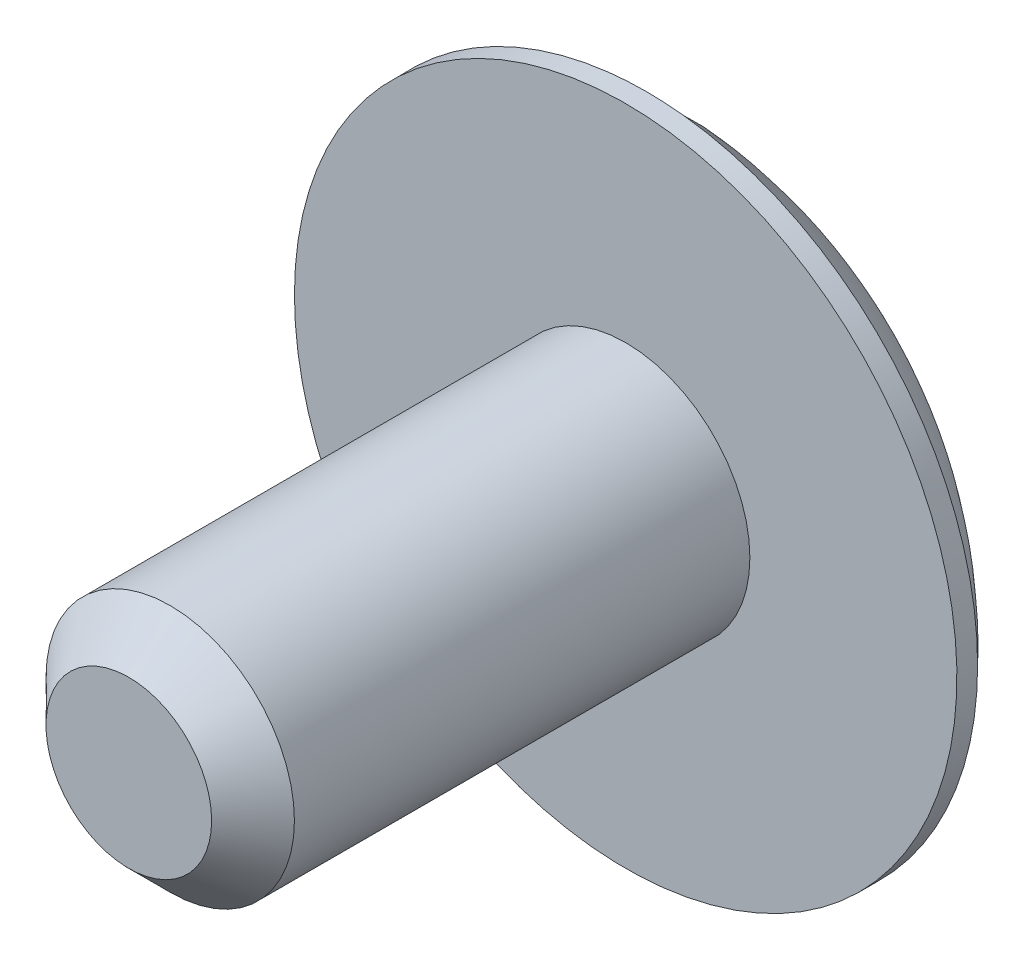
ISO-10303-21;
HEADER;
FILE_DESCRIPTION(('STEP AP214'),'2;1');
FILE_NAME('part.step','',(''),(''),'','','');
FILE_SCHEMA(('AUTOMOTIVE_DESIGN { 1 0 10303 214 1 1 1 1 }'));
ENDSEC;
DATA;
#1=APPLICATION_CONTEXT('core data for automotive mechanical design processes');
#2=APPLICATION_PROTOCOL_DEFINITION('international standard','automotive_design',2000,#1);
#3=PRODUCT_CONTEXT('',#1,'mechanical');
#4=PRODUCT('Part','Part','',(#3));
#5=PRODUCT_RELATED_PRODUCT_CATEGORY('part','',(#4));
#6=PRODUCT_DEFINITION_FORMATION('','',#4);
#7=PRODUCT_DEFINITION_CONTEXT('part definition',#1,'design');
#8=PRODUCT_DEFINITION('design','',#6,#7);
#9=PRODUCT_DEFINITION_SHAPE('','',#8);
#10=(LENGTH_UNIT() NAMED_UNIT(*) SI_UNIT(.MILLI.,.METRE.));
#11=(NAMED_UNIT(*) PLANE_ANGLE_UNIT() SI_UNIT($,.RADIAN.));
#12=(NAMED_UNIT(*) SI_UNIT($,.STERADIAN.) SOLID_ANGLE_UNIT());
#13=UNCERTAINTY_MEASURE_WITH_UNIT(LENGTH_MEASURE(1.E-05),#10,'distance_accuracy_value','');
#14=(GEOMETRIC_REPRESENTATION_CONTEXT(3) GLOBAL_UNCERTAINTY_ASSIGNED_CONTEXT((#13)) GLOBAL_UNIT_ASSIGNED_CONTEXT((#10,
#11,#12)) REPRESENTATION_CONTEXT('',''));
#15=CARTESIAN_POINT('',(0.,0.,0.));
#16=DIRECTION('',(0.,0.,1.));
#17=DIRECTION('',(1.,0.,0.));
#18=AXIS2_PLACEMENT_3D('',#15,#16,#17);
#19=CARTESIAN_POINT('',(0.,0.,6.89285714285714));
#20=DIRECTION('',(0.,0.,1.));
#21=DIRECTION('',(1.,0.,0.));
#22=AXIS2_PLACEMENT_3D('',#19,#20,#21);
#23=SPHERICAL_SURFACE('',#22,10.8928571428571);
#24=CARTESIAN_POINT('',(-0.9,0.,6.89285714285714));
#25=DIRECTION('',(-1.,0.,0.));
#26=DIRECTION('',(0.,0.,1.));
#27=AXIS2_PLACEMENT_3D('',#24,#25,#26);
#28=CIRCLE('',#27,10.8556131441155);
#29=CARTESIAN_POINT('',(-0.9,-7.94921379760288,-0.5));
#30=VERTEX_POINT('',#29);
#31=CARTESIAN_POINT('',(-0.9,-0.858628386596597,-3.92874597444597));
#32=VERTEX_POINT('',#31);
#33=EDGE_CURVE('E52',#30,#32,#28,.F.);
#34=ORIENTED_EDGE('',*,*,#33,.F.);
#35=CARTESIAN_POINT('',(0.,0.,-0.5));
#36=DIRECTION('',(0.,0.,-1.));
#37=DIRECTION('',(-1.,0.,0.));
#38=AXIS2_PLACEMENT_3D('',#35,#36,#37);
#39=CIRCLE('',#38,8.);
#40=CARTESIAN_POINT('',(-0.9,7.94921379760288,-0.5));
#41=VERTEX_POINT('',#40);
#42=EDGE_CURVE('E168',#30,#41,#39,.T.);
#43=ORIENTED_EDGE('',*,*,#42,.T.);
#44=CARTESIAN_POINT('',(-0.9,0.,6.89285714285714));
#45=DIRECTION('',(-1.,0.,0.));
#46=DIRECTION('',(0.,-1.,0.));
#47=AXIS2_PLACEMENT_3D('',#44,#45,#46);
#48=CIRCLE('',#47,10.8556131441155);
#49=CARTESIAN_POINT('',(-0.9,0.858628386596597,-3.92874597444597));
#50=VERTEX_POINT('',#49);
#51=EDGE_CURVE('E183',#50,#41,#48,.F.);
#52=ORIENTED_EDGE('',*,*,#51,.F.);
#53=CARTESIAN_POINT('',(0.,0.858628386596597,6.89285714285714));
#54=DIRECTION('',(0.,1.,0.));
#55=DIRECTION('',(-1.,0.,0.));
#56=AXIS2_PLACEMENT_3D('',#53,#54,#55);
#57=CIRCLE('',#56,10.8589637640258);
#58=CARTESIAN_POINT('',(-3.,0.858628386596596,-3.54347813483609));
#59=VERTEX_POINT('',#58);
#60=EDGE_CURVE('E185',#59,#50,#57,.F.);
#61=ORIENTED_EDGE('',*,*,#60,.F.);
#62=CARTESIAN_POINT('',(-3.,0.,6.89285714285714));
#63=DIRECTION('',(-1.,0.,0.));
#64=DIRECTION('',(0.,0.,1.));
#65=AXIS2_PLACEMENT_3D('',#62,#63,#64);
#66=CIRCLE('',#65,10.4715966659671);
#67=CARTESIAN_POINT('',(-3.,-0.858628386596598,-3.5434781348361));
#68=VERTEX_POINT('',#67);
#69=EDGE_CURVE('E187',#68,#59,#66,.F.);
#70=ORIENTED_EDGE('',*,*,#69,.F.);
#71=CARTESIAN_POINT('',(0.,-0.858628386596597,6.89285714285714));
#72=DIRECTION('',(0.,-1.,0.));
#73=DIRECTION('',(1.,0.,0.));
#74=AXIS2_PLACEMENT_3D('',#71,#72,#73);
#75=CIRCLE('',#74,10.8589637640258);
#76=EDGE_CURVE('E189',#32,#68,#75,.F.);
#77=ORIENTED_EDGE('',*,*,#76,.F.);
#78=EDGE_LOOP('',(#34,#43,#52,#61,#70,#77));
#79=FACE_BOUND('',#78,.T.);
#80=ADVANCED_FACE('F29',(#79),#23,.T.);
#81=CARTESIAN_POINT('',(0.,0.,12.));
#82=DIRECTION('',(0.,0.,-1.));
#83=DIRECTION('',(-1.,0.,0.));
#84=AXIS2_PLACEMENT_3D('',#81,#82,#83);
#85=CYLINDRICAL_SURFACE('',#84,3.);
#86=CARTESIAN_POINT('',(0.,0.,11.));
#87=DIRECTION('',(0.,0.,1.));
#88=DIRECTION('',(1.,0.,0.));
#89=AXIS2_PLACEMENT_3D('',#86,#87,#88);
#90=CIRCLE('',#89,3.);
#91=CARTESIAN_POINT('',(3.,0.,11.));
#92=VERTEX_POINT('',#91);
#93=EDGE_CURVE('E11',#92,#92,#90,.F.);
#94=ORIENTED_EDGE('',*,*,#93,.T.);
#95=EDGE_LOOP('',(#94));
#96=FACE_BOUND('',#95,.T.);
#97=CARTESIAN_POINT('',(0.,0.,0.));
#98=DIRECTION('',(0.,0.,-1.));
#99=DIRECTION('',(-1.,0.,0.));
#100=AXIS2_PLACEMENT_3D('',#97,#98,#99);
#101=CIRCLE('',#100,3.);
#102=CARTESIAN_POINT('',(-3.,0.,0.));
#103=VERTEX_POINT('',#102);
#104=EDGE_CURVE('E171',#103,#103,#101,.T.);
#105=ORIENTED_EDGE('',*,*,#104,.F.);
#106=EDGE_LOOP('',(#105));
#107=FACE_BOUND('',#106,.T.);
#108=ADVANCED_FACE('F206',(#96,#107),#85,.T.);
#109=CARTESIAN_POINT('',(0.,0.,12.));
#110=DIRECTION('',(0.,0.,1.));
#111=DIRECTION('',(1.,0.,0.));
#112=AXIS2_PLACEMENT_3D('',#109,#110,#111);
#113=PLANE('',#112);
#114=CARTESIAN_POINT('',(0.,0.,12.));
#115=DIRECTION('',(0.,0.,1.));
#116=DIRECTION('',(1.,0.,0.));
#117=AXIS2_PLACEMENT_3D('',#114,#115,#116);
#118=CIRCLE('',#117,2.);
#119=CARTESIAN_POINT('',(2.,0.,12.));
#120=VERTEX_POINT('',#119);
#121=EDGE_CURVE('E37',#120,#120,#118,.T.);
#122=ORIENTED_EDGE('',*,*,#121,.T.);
#123=EDGE_LOOP('',(#122));
#124=FACE_BOUND('',#123,.T.);
#125=ADVANCED_FACE('F194',(#124),#113,.T.);
#126=CARTESIAN_POINT('',(0.,0.,0.));
#127=DIRECTION('',(0.,0.,-1.));
#128=DIRECTION('',(-1.,0.,0.));
#129=AXIS2_PLACEMENT_3D('',#126,#127,#128);
#130=PLANE('',#129);
#131=CARTESIAN_POINT('',(0.,0.,0.));
#132=DIRECTION('',(0.,0.,-1.));
#133=DIRECTION('',(-1.,0.,0.));
#134=AXIS2_PLACEMENT_3D('',#131,#132,#133);
#135=CIRCLE('',#134,8.);
#136=CARTESIAN_POINT('',(-8.,0.,0.));
#137=VERTEX_POINT('',#136);
#138=EDGE_CURVE('E154',#137,#137,#135,.T.);
#139=ORIENTED_EDGE('',*,*,#138,.F.);
#140=EDGE_LOOP('',(#139));
#141=FACE_BOUND('',#140,.T.);
#142=ORIENTED_EDGE('',*,*,#104,.T.);
#143=EDGE_LOOP('',(#142));
#144=FACE_BOUND('',#143,.T.);
#145=ADVANCED_FACE('F221',(#141,#144),#130,.F.);
#146=CARTESIAN_POINT('',(0.,0.,-0.5));
#147=DIRECTION('',(0.,0.,1.));
#148=DIRECTION('',(1.,0.,0.));
#149=AXIS2_PLACEMENT_3D('',#146,#147,#148);
#150=CYLINDRICAL_SURFACE('',#149,8.);
#151=CARTESIAN_POINT('',(0.9,7.94921379760288,-0.5));
#152=VERTEX_POINT('',#151);
#153=EDGE_CURVE('E169',#41,#152,#39,.T.);
#154=ORIENTED_EDGE('',*,*,#153,.F.);
#155=ORIENTED_EDGE('',*,*,#42,.F.);
#156=CARTESIAN_POINT('',(0.900000000000004,-7.94921379760288,-0.5));
#157=VERTEX_POINT('',#156);
#158=EDGE_CURVE('E230',#157,#30,#39,.T.);
#159=ORIENTED_EDGE('',*,*,#158,.F.);
#160=EDGE_CURVE('E172',#152,#157,#39,.T.);
#161=ORIENTED_EDGE('',*,*,#160,.F.);
#162=EDGE_LOOP('',(#154,#155,#159,#161));
#163=FACE_BOUND('',#162,.T.);
#164=ORIENTED_EDGE('',*,*,#138,.T.);
#165=EDGE_LOOP('',(#164));
#166=FACE_BOUND('',#165,.T.);
#167=ADVANCED_FACE('F213',(#163,#166),#150,.T.);
#168=CARTESIAN_POINT('',(0.900000000000002,0.,6.89285714285714));
#169=DIRECTION('',(1.,0.,0.));
#170=DIRECTION('',(0.,1.,0.));
#171=AXIS2_PLACEMENT_3D('',#168,#169,#170);
#172=CIRCLE('',#171,10.8556131441155);
#173=CARTESIAN_POINT('',(0.900000000000003,-0.858628386596598,-3.92874597444597));
#174=VERTEX_POINT('',#173);
#175=EDGE_CURVE('E124',#174,#157,#172,.F.);
#176=ORIENTED_EDGE('',*,*,#175,.F.);
#177=CARTESIAN_POINT('',(0.,-0.858628386596599,6.89285714285714));
#178=DIRECTION('',(0.,-1.,0.));
#179=DIRECTION('',(1.,0.,0.));
#180=AXIS2_PLACEMENT_3D('',#177,#178,#179);
#181=CIRCLE('',#180,10.8589637640258);
#182=CARTESIAN_POINT('',(3.,-0.858628386596598,-3.54347813483609));
#183=VERTEX_POINT('',#182);
#184=EDGE_CURVE('E115',#183,#174,#181,.F.);
#185=ORIENTED_EDGE('',*,*,#184,.F.);
#186=CARTESIAN_POINT('',(3.,0.,6.89285714285714));
#187=DIRECTION('',(1.,0.,0.));
#188=DIRECTION('',(0.,1.,0.));
#189=AXIS2_PLACEMENT_3D('',#186,#187,#188);
#190=CIRCLE('',#189,10.4715966659671);
#191=CARTESIAN_POINT('',(3.,0.858628386596597,-3.5434781348361));
#192=VERTEX_POINT('',#191);
#193=EDGE_CURVE('E176',#192,#183,#190,.F.);
#194=ORIENTED_EDGE('',*,*,#193,.F.);
#195=CARTESIAN_POINT('',(0.,0.858628386596597,6.89285714285714));
#196=DIRECTION('',(0.,1.,0.));
#197=DIRECTION('',(0.,0.,1.));
#198=AXIS2_PLACEMENT_3D('',#195,#196,#197);
#199=CIRCLE('',#198,10.8589637640258);
#200=CARTESIAN_POINT('',(0.900000000000002,0.858628386596597,-3.92874597444597));
#201=VERTEX_POINT('',#200);
#202=EDGE_CURVE('E178',#201,#192,#199,.F.);
#203=ORIENTED_EDGE('',*,*,#202,.F.);
#204=CARTESIAN_POINT('',(0.900000000000002,0.,6.89285714285714));
#205=DIRECTION('',(1.,0.,0.));
#206=DIRECTION('',(0.,1.,0.));
#207=AXIS2_PLACEMENT_3D('',#204,#205,#206);
#208=CIRCLE('',#207,10.8556131441155);
#209=EDGE_CURVE('E180',#152,#201,#208,.F.);
#210=ORIENTED_EDGE('',*,*,#209,.F.);
#211=ORIENTED_EDGE('',*,*,#160,.T.);
#212=EDGE_LOOP('',(#176,#185,#194,#203,#210,#211));
#213=FACE_BOUND('',#212,.T.);
#214=ADVANCED_FACE('F31',(#213),#23,.T.);
#215=CARTESIAN_POINT('',(0.900000000000005,-8.99795501022492,-5.5));
#216=DIRECTION('',(1.,0.,0.));
#217=DIRECTION('',(0.,1.,0.));
#218=AXIS2_PLACEMENT_3D('',#215,#216,#217);
#219=PLANE('',#218);
#220=ORIENTED_EDGE('',*,*,#175,.T.);
#221=DIRECTION('',(0.,1.,0.));
#222=VECTOR('',#221,1.);
#223=CARTESIAN_POINT('',(0.900000000000005,-8.99795501022492,-0.5));
#224=LINE('',#223,#222);
#225=CARTESIAN_POINT('',(0.900000000000003,-0.858628386596598,-0.5));
#226=VERTEX_POINT('',#225);
#227=EDGE_CURVE('E122',#157,#226,#224,.T.);
#228=ORIENTED_EDGE('',*,*,#227,.T.);
#229=DIRECTION('',(0.,0.,1.));
#230=VECTOR('',#229,1.);
#231=CARTESIAN_POINT('',(0.900000000000003,-0.858628386596598,-5.5));
#232=LINE('',#231,#230);
#233=EDGE_CURVE('E108',#174,#226,#232,.T.);
#234=ORIENTED_EDGE('',*,*,#233,.F.);
#235=EDGE_LOOP('',(#220,#228,#234));
#236=FACE_BOUND('',#235,.T.);
#237=ADVANCED_FACE('F123',(#236),#219,.F.);
#238=CARTESIAN_POINT('',(-0.9,-8.99795501022492,-5.5));
#239=DIRECTION('',(-1.,0.,0.));
#240=DIRECTION('',(0.,0.,1.));
#241=AXIS2_PLACEMENT_3D('',#238,#239,#240);
#242=PLANE('',#241);
#243=ORIENTED_EDGE('',*,*,#33,.T.);
#244=DIRECTION('',(0.,0.,1.));
#245=VECTOR('',#244,1.);
#246=CARTESIAN_POINT('',(-0.9,-0.858628386596597,-5.5));
#247=LINE('',#246,#245);
#248=CARTESIAN_POINT('',(-0.9,-0.858628386596597,-0.5));
#249=VERTEX_POINT('',#248);
#250=EDGE_CURVE('E152',#32,#249,#247,.T.);
#251=ORIENTED_EDGE('',*,*,#250,.T.);
#252=DIRECTION('',(0.,-1.,0.));
#253=VECTOR('',#252,1.);
#254=CARTESIAN_POINT('',(-0.9,-8.99795501022492,-0.5));
#255=LINE('',#254,#253);
#256=EDGE_CURVE('E119',#249,#30,#255,.T.);
#257=ORIENTED_EDGE('',*,*,#256,.T.);
#258=EDGE_LOOP('',(#243,#251,#257));
#259=FACE_BOUND('',#258,.T.);
#260=ADVANCED_FACE('F219',(#259),#242,.F.);
#261=CARTESIAN_POINT('',(-0.9,-0.858628386596597,-5.5));
#262=DIRECTION('',(0.,-1.,0.));
#263=DIRECTION('',(1.,0.,0.));
#264=AXIS2_PLACEMENT_3D('',#261,#262,#263);
#265=PLANE('',#264);
#266=ORIENTED_EDGE('',*,*,#76,.T.);
#267=DIRECTION('',(0.,0.,1.));
#268=VECTOR('',#267,1.);
#269=CARTESIAN_POINT('',(-3.,-0.858628386596598,-5.5));
#270=LINE('',#269,#268);
#271=CARTESIAN_POINT('',(-3.,-0.858628386596598,-0.5));
#272=VERTEX_POINT('',#271);
#273=EDGE_CURVE('E155',#68,#272,#270,.T.);
#274=ORIENTED_EDGE('',*,*,#273,.T.);
#275=DIRECTION('',(1.,0.,0.));
#276=VECTOR('',#275,1.);
#277=CARTESIAN_POINT('',(-0.9,-0.858628386596597,-0.5));
#278=LINE('',#277,#276);
#279=EDGE_CURVE('E148',#272,#249,#278,.T.);
#280=ORIENTED_EDGE('',*,*,#279,.T.);
#281=ORIENTED_EDGE('',*,*,#250,.F.);
#282=EDGE_LOOP('',(#266,#274,#280,#281));
#283=FACE_BOUND('',#282,.T.);
#284=ADVANCED_FACE('F294',(#283),#265,.F.);
#285=CARTESIAN_POINT('',(-3.,-0.858628386596598,-5.5));
#286=DIRECTION('',(-1.,0.,0.));
#287=DIRECTION('',(0.,0.,1.));
#288=AXIS2_PLACEMENT_3D('',#285,#286,#287);
#289=PLANE('',#288);
#290=ORIENTED_EDGE('',*,*,#69,.T.);
#291=DIRECTION('',(0.,0.,1.));
#292=VECTOR('',#291,1.);
#293=CARTESIAN_POINT('',(-3.,0.858628386596596,-5.5));
#294=LINE('',#293,#292);
#295=CARTESIAN_POINT('',(-3.,0.858628386596596,-0.5));
#296=VERTEX_POINT('',#295);
#297=EDGE_CURVE('E157',#59,#296,#294,.T.);
#298=ORIENTED_EDGE('',*,*,#297,.T.);
#299=DIRECTION('',(0.,-1.,0.));
#300=VECTOR('',#299,1.);
#301=CARTESIAN_POINT('',(-3.,-0.858628386596598,-0.5));
#302=LINE('',#301,#300);
#303=EDGE_CURVE('E145',#296,#272,#302,.T.);
#304=ORIENTED_EDGE('',*,*,#303,.T.);
#305=ORIENTED_EDGE('',*,*,#273,.F.);
#306=EDGE_LOOP('',(#290,#298,#304,#305));
#307=FACE_BOUND('',#306,.T.);
#308=ADVANCED_FACE('F303',(#307),#289,.F.);
#309=CARTESIAN_POINT('',(-0.9,0.858628386596597,-5.5));
#310=DIRECTION('',(0.,1.,0.));
#311=DIRECTION('',(-1.,0.,0.));
#312=AXIS2_PLACEMENT_3D('',#309,#310,#311);
#313=PLANE('',#312);
#314=ORIENTED_EDGE('',*,*,#60,.T.);
#315=DIRECTION('',(0.,0.,1.));
#316=VECTOR('',#315,1.);
#317=CARTESIAN_POINT('',(-0.9,0.858628386596597,-5.5));
#318=LINE('',#317,#316);
#319=CARTESIAN_POINT('',(-0.9,0.858628386596597,-0.5));
#320=VERTEX_POINT('',#319);
#321=EDGE_CURVE('E159',#50,#320,#318,.T.);
#322=ORIENTED_EDGE('',*,*,#321,.T.);
#323=DIRECTION('',(-1.,0.,0.));
#324=VECTOR('',#323,1.);
#325=CARTESIAN_POINT('',(-0.9,0.858628386596597,-0.5));
#326=LINE('',#325,#324);
#327=EDGE_CURVE('E142',#320,#296,#326,.T.);
#328=ORIENTED_EDGE('',*,*,#327,.T.);
#329=ORIENTED_EDGE('',*,*,#297,.F.);
#330=EDGE_LOOP('',(#314,#322,#328,#329));
#331=FACE_BOUND('',#330,.T.);
#332=ADVANCED_FACE('F313',(#331),#313,.F.);
#333=CARTESIAN_POINT('',(-0.9,0.858628386596597,-5.5));
#334=DIRECTION('',(-1.,0.,0.));
#335=DIRECTION('',(0.,-1.,0.));
#336=AXIS2_PLACEMENT_3D('',#333,#334,#335);
#337=PLANE('',#336);
#338=ORIENTED_EDGE('',*,*,#51,.T.);
#339=DIRECTION('',(0.,-1.,0.));
#340=VECTOR('',#339,1.);
#341=CARTESIAN_POINT('',(-0.9,0.858628386596597,-0.5));
#342=LINE('',#341,#340);
#343=EDGE_CURVE('E44',#41,#320,#342,.T.);
#344=ORIENTED_EDGE('',*,*,#343,.T.);
#345=ORIENTED_EDGE('',*,*,#321,.F.);
#346=EDGE_LOOP('',(#338,#344,#345));
#347=FACE_BOUND('',#346,.T.);
#348=ADVANCED_FACE('F323',(#347),#337,.F.);
#349=CARTESIAN_POINT('',(0.900000000000002,0.858628386596597,-5.5));
#350=DIRECTION('',(1.,0.,0.));
#351=DIRECTION('',(0.,1.,0.));
#352=AXIS2_PLACEMENT_3D('',#349,#350,#351);
#353=PLANE('',#352);
#354=ORIENTED_EDGE('',*,*,#209,.T.);
#355=DIRECTION('',(0.,0.,1.));
#356=VECTOR('',#355,1.);
#357=CARTESIAN_POINT('',(0.900000000000002,0.858628386596597,-5.5));
#358=LINE('',#357,#356);
#359=CARTESIAN_POINT('',(0.900000000000002,0.858628386596597,-0.5));
#360=VERTEX_POINT('',#359);
#361=EDGE_CURVE('E161',#201,#360,#358,.T.);
#362=ORIENTED_EDGE('',*,*,#361,.T.);
#363=DIRECTION('',(0.,1.,0.));
#364=VECTOR('',#363,1.);
#365=CARTESIAN_POINT('',(0.900000000000002,0.858628386596597,-0.5));
#366=LINE('',#365,#364);
#367=EDGE_CURVE('E138',#360,#152,#366,.T.);
#368=ORIENTED_EDGE('',*,*,#367,.T.);
#369=EDGE_LOOP('',(#354,#362,#368));
#370=FACE_BOUND('',#369,.T.);
#371=ADVANCED_FACE('F240',(#370),#353,.F.);
#372=CARTESIAN_POINT('',(3.,0.858628386596597,-5.5));
#373=DIRECTION('',(0.,1.,0.));
#374=DIRECTION('',(0.,0.,1.));
#375=AXIS2_PLACEMENT_3D('',#372,#373,#374);
#376=PLANE('',#375);
#377=ORIENTED_EDGE('',*,*,#202,.T.);
#378=DIRECTION('',(0.,0.,1.));
#379=VECTOR('',#378,1.);
#380=CARTESIAN_POINT('',(3.,0.858628386596597,-5.5));
#381=LINE('',#380,#379);
#382=CARTESIAN_POINT('',(3.,0.858628386596597,-0.5));
#383=VERTEX_POINT('',#382);
#384=EDGE_CURVE('E163',#192,#383,#381,.T.);
#385=ORIENTED_EDGE('',*,*,#384,.T.);
#386=DIRECTION('',(-1.,0.,0.));
#387=VECTOR('',#386,1.);
#388=CARTESIAN_POINT('',(3.,0.858628386596597,-0.5));
#389=LINE('',#388,#387);
#390=EDGE_CURVE('E133',#383,#360,#389,.T.);
#391=ORIENTED_EDGE('',*,*,#390,.T.);
#392=ORIENTED_EDGE('',*,*,#361,.F.);
#393=EDGE_LOOP('',(#377,#385,#391,#392));
#394=FACE_BOUND('',#393,.T.);
#395=ADVANCED_FACE('F243',(#394),#376,.F.);
#396=CARTESIAN_POINT('',(3.,-0.858628386596598,-5.5));
#397=DIRECTION('',(1.,0.,0.));
#398=DIRECTION('',(0.,1.,0.));
#399=AXIS2_PLACEMENT_3D('',#396,#397,#398);
#400=PLANE('',#399);
#401=ORIENTED_EDGE('',*,*,#193,.T.);
#402=DIRECTION('',(0.,0.,1.));
#403=VECTOR('',#402,1.);
#404=CARTESIAN_POINT('',(3.,-0.858628386596598,-5.5));
#405=LINE('',#404,#403);
#406=CARTESIAN_POINT('',(3.,-0.858628386596598,-0.5));
#407=VERTEX_POINT('',#406);
#408=EDGE_CURVE('E118',#183,#407,#405,.T.);
#409=ORIENTED_EDGE('',*,*,#408,.T.);
#410=DIRECTION('',(0.,1.,0.));
#411=VECTOR('',#410,1.);
#412=CARTESIAN_POINT('',(3.,-0.858628386596598,-0.5));
#413=LINE('',#412,#411);
#414=EDGE_CURVE('E131',#407,#383,#413,.T.);
#415=ORIENTED_EDGE('',*,*,#414,.T.);
#416=ORIENTED_EDGE('',*,*,#384,.F.);
#417=EDGE_LOOP('',(#401,#409,#415,#416));
#418=FACE_BOUND('',#417,.T.);
#419=ADVANCED_FACE('F246',(#418),#400,.F.);
#420=CARTESIAN_POINT('',(3.,-0.858628386596598,-5.5));
#421=DIRECTION('',(0.,-1.,0.));
#422=DIRECTION('',(1.,0.,0.));
#423=AXIS2_PLACEMENT_3D('',#420,#421,#422);
#424=PLANE('',#423);
#425=ORIENTED_EDGE('',*,*,#184,.T.);
#426=ORIENTED_EDGE('',*,*,#233,.T.);
#427=DIRECTION('',(1.,0.,0.));
#428=VECTOR('',#427,1.);
#429=CARTESIAN_POINT('',(3.,-0.858628386596598,-0.5));
#430=LINE('',#429,#428);
#431=EDGE_CURVE('E113',#226,#407,#430,.T.);
#432=ORIENTED_EDGE('',*,*,#431,.T.);
#433=ORIENTED_EDGE('',*,*,#408,.F.);
#434=EDGE_LOOP('',(#425,#426,#432,#433));
#435=FACE_BOUND('',#434,.T.);
#436=ADVANCED_FACE('F110',(#435),#424,.F.);
#437=CARTESIAN_POINT('',(0.900000000000002,0.858628386596597,-0.5));
#438=DIRECTION('',(0.,0.,1.));
#439=DIRECTION('',(1.,0.,0.));
#440=AXIS2_PLACEMENT_3D('',#437,#438,#439);
#441=PLANE('',#440);
#442=ORIENTED_EDGE('',*,*,#158,.T.);
#443=ORIENTED_EDGE('',*,*,#256,.F.);
#444=ORIENTED_EDGE('',*,*,#279,.F.);
#445=ORIENTED_EDGE('',*,*,#303,.F.);
#446=ORIENTED_EDGE('',*,*,#327,.F.);
#447=ORIENTED_EDGE('',*,*,#343,.F.);
#448=ORIENTED_EDGE('',*,*,#153,.T.);
#449=ORIENTED_EDGE('',*,*,#367,.F.);
#450=ORIENTED_EDGE('',*,*,#390,.F.);
#451=ORIENTED_EDGE('',*,*,#414,.F.);
#452=ORIENTED_EDGE('',*,*,#431,.F.);
#453=ORIENTED_EDGE('',*,*,#227,.F.);
#454=EDGE_LOOP('',(#442,#443,#444,#445,#446,#447,#448,#449,#450,#451,#452,#453));
#455=FACE_BOUND('',#454,.T.);
#456=ADVANCED_FACE('F128',(#455),#441,.F.);
#457=CARTESIAN_POINT('',(0.,0.,12.));
#458=DIRECTION('',(0.,0.,-1.));
#459=DIRECTION('',(-1.,0.,0.));
#460=AXIS2_PLACEMENT_3D('',#457,#458,#459);
#461=CONICAL_SURFACE('',#460,2.,0.785398163397447);
#462=ORIENTED_EDGE('',*,*,#93,.F.);
#463=EDGE_LOOP('',(#462));
#464=FACE_BOUND('',#463,.T.);
#465=ORIENTED_EDGE('',*,*,#121,.F.);
#466=EDGE_LOOP('',(#465));
#467=FACE_BOUND('',#466,.T.);
#468=ADVANCED_FACE('F196',(#464,#467),#461,.T.);
#469=CLOSED_SHELL('',(#80,#108,#125,#145,#167,#214,#237,#260,#284,#308,#332,#348,#371,#395,#419,
#436,#456,#468));
#470=MANIFOLD_SOLID_BREP('B2',#469);
#471=ADVANCED_BREP_SHAPE_REPRESENTATION('',(#18,#470),#14);
#472=SHAPE_DEFINITION_REPRESENTATION(#9,#471);
ENDSEC;
END-ISO-10303-21;
